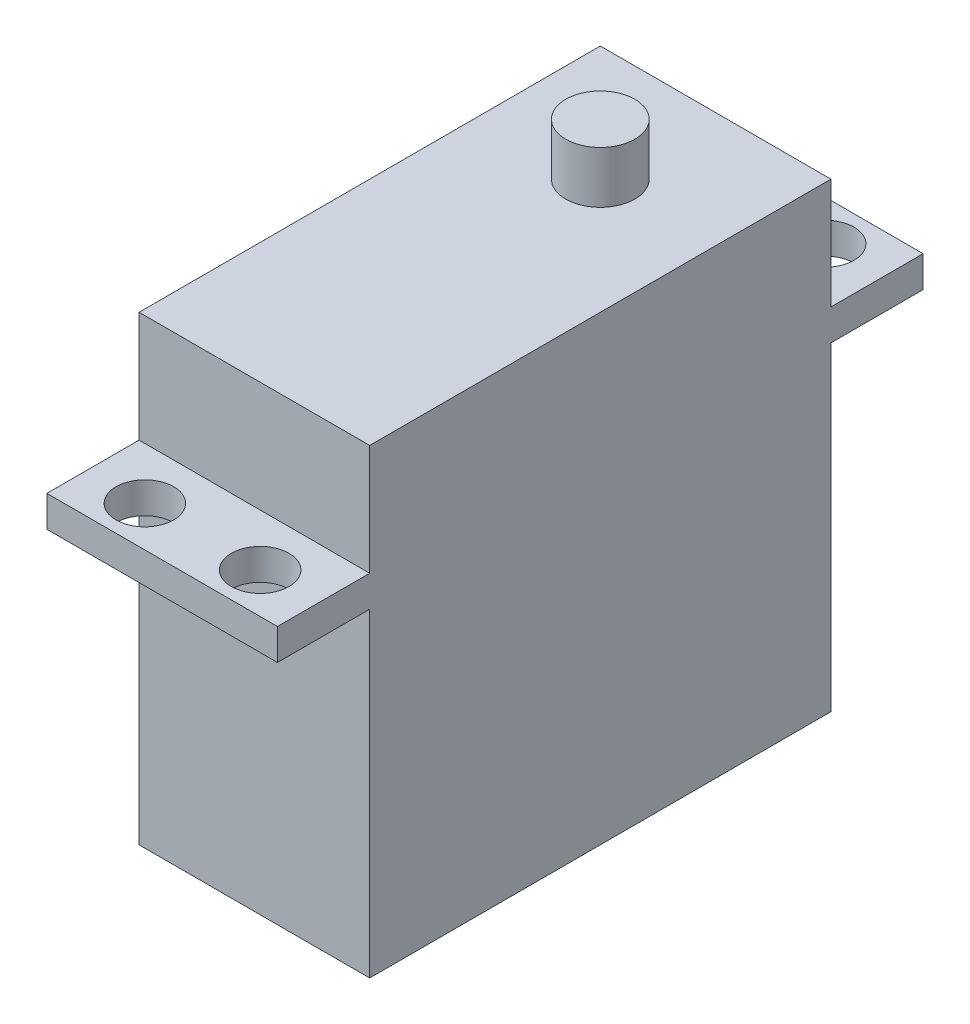
ISO-10303-21;
HEADER;
FILE_DESCRIPTION(('STEP AP214'),'2;1');
FILE_NAME('part.step','',(''),(''),'','','');
FILE_SCHEMA(('AUTOMOTIVE_DESIGN { 1 0 10303 214 1 1 1 1 }'));
ENDSEC;
DATA;
#1=APPLICATION_CONTEXT('core data for automotive mechanical design processes');
#2=APPLICATION_PROTOCOL_DEFINITION('international standard','automotive_design',2000,#1);
#3=PRODUCT_CONTEXT('',#1,'mechanical');
#4=PRODUCT('Part','Part','',(#3));
#5=PRODUCT_RELATED_PRODUCT_CATEGORY('part','',(#4));
#6=PRODUCT_DEFINITION_FORMATION('','',#4);
#7=PRODUCT_DEFINITION_CONTEXT('part definition',#1,'design');
#8=PRODUCT_DEFINITION('design','',#6,#7);
#9=PRODUCT_DEFINITION_SHAPE('','',#8);
#10=(LENGTH_UNIT() NAMED_UNIT(*) SI_UNIT(.MILLI.,.METRE.));
#11=(NAMED_UNIT(*) PLANE_ANGLE_UNIT() SI_UNIT($,.RADIAN.));
#12=(NAMED_UNIT(*) SI_UNIT($,.STERADIAN.) SOLID_ANGLE_UNIT());
#13=UNCERTAINTY_MEASURE_WITH_UNIT(LENGTH_MEASURE(1.E-05),#10,'distance_accuracy_value','');
#14=(GEOMETRIC_REPRESENTATION_CONTEXT(3) GLOBAL_UNCERTAINTY_ASSIGNED_CONTEXT((#13)) GLOBAL_UNIT_ASSIGNED_CONTEXT((#10,
#11,#12)) REPRESENTATION_CONTEXT('',''));
#15=CARTESIAN_POINT('',(0.,0.,0.));
#16=DIRECTION('',(0.,0.,1.));
#17=DIRECTION('',(1.,0.,0.));
#18=AXIS2_PLACEMENT_3D('',#15,#16,#17);
#19=CARTESIAN_POINT('',(-9.99999999999999,40.,20.));
#20=DIRECTION('',(0.,0.,-1.));
#21=DIRECTION('',(-1.,0.,0.));
#22=AXIS2_PLACEMENT_3D('',#19,#20,#21);
#23=PLANE('',#22);
#24=DIRECTION('',(1.,0.,0.));
#25=VECTOR('',#24,1.);
#26=CARTESIAN_POINT('',(-18.4433405711247,27.7,20.));
#27=LINE('',#26,#25);
#28=CARTESIAN_POINT('',(-9.99999999999999,27.7,20.));
#29=VERTEX_POINT('',#28);
#30=CARTESIAN_POINT('',(10.,27.7,20.));
#31=VERTEX_POINT('',#30);
#32=EDGE_CURVE('E56',#29,#31,#27,.T.);
#33=ORIENTED_EDGE('',*,*,#32,.F.);
#34=DIRECTION('',(0.,-1.,0.));
#35=VECTOR('',#34,1.);
#36=CARTESIAN_POINT('',(-9.99999999999999,40.,20.));
#37=LINE('',#36,#35);
#38=CARTESIAN_POINT('',(-9.99999999999999,0.,20.));
#39=VERTEX_POINT('',#38);
#40=EDGE_CURVE('E135',#29,#39,#37,.T.);
#41=ORIENTED_EDGE('',*,*,#40,.T.);
#42=DIRECTION('',(1.,0.,0.));
#43=VECTOR('',#42,1.);
#44=CARTESIAN_POINT('',(-9.99999999999999,0.,20.));
#45=LINE('',#44,#43);
#46=CARTESIAN_POINT('',(10.,0.,20.));
#47=VERTEX_POINT('',#46);
#48=EDGE_CURVE('E194',#39,#47,#45,.T.);
#49=ORIENTED_EDGE('',*,*,#48,.T.);
#50=DIRECTION('',(0.,-1.,0.));
#51=VECTOR('',#50,1.);
#52=CARTESIAN_POINT('',(10.,40.,20.));
#53=LINE('',#52,#51);
#54=EDGE_CURVE('E200',#31,#47,#53,.T.);
#55=ORIENTED_EDGE('',*,*,#54,.F.);
#56=EDGE_LOOP('',(#33,#41,#49,#55));
#57=FACE_BOUND('',#56,.T.);
#58=ADVANCED_FACE('F39',(#57),#23,.F.);
#59=CARTESIAN_POINT('',(-10.,40.,-20.));
#60=DIRECTION('',(0.,0.,1.));
#61=DIRECTION('',(1.,0.,0.));
#62=AXIS2_PLACEMENT_3D('',#59,#60,#61);
#63=PLANE('',#62);
#64=DIRECTION('',(1.,0.,0.));
#65=VECTOR('',#64,1.);
#66=CARTESIAN_POINT('',(-18.4433405711247,30.4,-20.));
#67=LINE('',#66,#65);
#68=CARTESIAN_POINT('',(-10.,30.4,-20.));
#69=VERTEX_POINT('',#68);
#70=CARTESIAN_POINT('',(10.,30.4,-20.));
#71=VERTEX_POINT('',#70);
#72=EDGE_CURVE('E168',#69,#71,#67,.T.);
#73=ORIENTED_EDGE('',*,*,#72,.F.);
#74=DIRECTION('',(0.,-1.,0.));
#75=VECTOR('',#74,1.);
#76=CARTESIAN_POINT('',(-10.,40.,-20.));
#77=LINE('',#76,#75);
#78=CARTESIAN_POINT('',(-10.,40.,-20.));
#79=VERTEX_POINT('',#78);
#80=EDGE_CURVE('E215',#79,#69,#77,.T.);
#81=ORIENTED_EDGE('',*,*,#80,.F.);
#82=DIRECTION('',(-1.,0.,0.));
#83=VECTOR('',#82,1.);
#84=CARTESIAN_POINT('',(-10.,40.,-20.));
#85=LINE('',#84,#83);
#86=CARTESIAN_POINT('',(10.,40.,-20.));
#87=VERTEX_POINT('',#86);
#88=EDGE_CURVE('E193',#87,#79,#85,.T.);
#89=ORIENTED_EDGE('',*,*,#88,.F.);
#90=DIRECTION('',(0.,-1.,0.));
#91=VECTOR('',#90,1.);
#92=CARTESIAN_POINT('',(10.,40.,-20.));
#93=LINE('',#92,#91);
#94=EDGE_CURVE('E11',#87,#71,#93,.T.);
#95=ORIENTED_EDGE('',*,*,#94,.T.);
#96=EDGE_LOOP('',(#73,#81,#89,#95));
#97=FACE_BOUND('',#96,.T.);
#98=ADVANCED_FACE('F268',(#97),#63,.F.);
#99=CARTESIAN_POINT('',(10.,40.,-20.));
#100=DIRECTION('',(-1.,0.,0.));
#101=DIRECTION('',(0.,0.,1.));
#102=AXIS2_PLACEMENT_3D('',#99,#100,#101);
#103=PLANE('',#102);
#104=DIRECTION('',(0.,0.,-1.));
#105=VECTOR('',#104,1.);
#106=CARTESIAN_POINT('',(10.,0.,-20.));
#107=LINE('',#106,#105);
#108=CARTESIAN_POINT('',(10.,0.,-20.));
#109=VERTEX_POINT('',#108);
#110=EDGE_CURVE('E189',#47,#109,#107,.T.);
#111=ORIENTED_EDGE('',*,*,#110,.T.);
#112=CARTESIAN_POINT('',(10.,27.7,-20.));
#113=VERTEX_POINT('',#112);
#114=EDGE_CURVE('E48',#113,#109,#93,.T.);
#115=ORIENTED_EDGE('',*,*,#114,.F.);
#116=DIRECTION('',(0.,0.,-1.));
#117=VECTOR('',#116,1.);
#118=CARTESIAN_POINT('',(10.,27.7,-20.));
#119=LINE('',#118,#117);
#120=CARTESIAN_POINT('',(10.,27.7,-28.));
#121=VERTEX_POINT('',#120);
#122=EDGE_CURVE('E163',#113,#121,#119,.T.);
#123=ORIENTED_EDGE('',*,*,#122,.T.);
#124=DIRECTION('',(0.,1.,0.));
#125=VECTOR('',#124,1.);
#126=CARTESIAN_POINT('',(10.,30.4,-28.));
#127=LINE('',#126,#125);
#128=CARTESIAN_POINT('',(10.,30.4,-28.));
#129=VERTEX_POINT('',#128);
#130=EDGE_CURVE('E173',#121,#129,#127,.T.);
#131=ORIENTED_EDGE('',*,*,#130,.T.);
#132=DIRECTION('',(0.,0.,1.));
#133=VECTOR('',#132,1.);
#134=CARTESIAN_POINT('',(10.,30.4,-20.));
#135=LINE('',#134,#133);
#136=EDGE_CURVE('E176',#129,#71,#135,.T.);
#137=ORIENTED_EDGE('',*,*,#136,.T.);
#138=ORIENTED_EDGE('',*,*,#94,.F.);
#139=DIRECTION('',(0.,0.,-1.));
#140=VECTOR('',#139,1.);
#141=CARTESIAN_POINT('',(10.,40.,-20.));
#142=LINE('',#141,#140);
#143=CARTESIAN_POINT('',(10.,40.,20.));
#144=VERTEX_POINT('',#143);
#145=EDGE_CURVE('E190',#144,#87,#142,.T.);
#146=ORIENTED_EDGE('',*,*,#145,.F.);
#147=CARTESIAN_POINT('',(10.,30.4,20.));
#148=VERTEX_POINT('',#147);
#149=EDGE_CURVE('E210',#144,#148,#53,.T.);
#150=ORIENTED_EDGE('',*,*,#149,.T.);
#151=DIRECTION('',(0.,0.,1.));
#152=VECTOR('',#151,1.);
#153=CARTESIAN_POINT('',(10.,30.4,20.));
#154=LINE('',#153,#152);
#155=CARTESIAN_POINT('',(10.,30.4,28.));
#156=VERTEX_POINT('',#155);
#157=EDGE_CURVE('E161',#148,#156,#154,.T.);
#158=ORIENTED_EDGE('',*,*,#157,.T.);
#159=DIRECTION('',(0.,-1.,0.));
#160=VECTOR('',#159,1.);
#161=CARTESIAN_POINT('',(10.,30.4,28.));
#162=LINE('',#161,#160);
#163=CARTESIAN_POINT('',(10.,27.7,28.));
#164=VERTEX_POINT('',#163);
#165=EDGE_CURVE('E159',#156,#164,#162,.T.);
#166=ORIENTED_EDGE('',*,*,#165,.T.);
#167=DIRECTION('',(0.,0.,-1.));
#168=VECTOR('',#167,1.);
#169=CARTESIAN_POINT('',(10.,27.7,20.));
#170=LINE('',#169,#168);
#171=EDGE_CURVE('E151',#164,#31,#170,.T.);
#172=ORIENTED_EDGE('',*,*,#171,.T.);
#173=ORIENTED_EDGE('',*,*,#54,.T.);
#174=EDGE_LOOP('',(#111,#115,#123,#131,#137,#138,#146,#150,#158,#166,#172,#173));
#175=FACE_BOUND('',#174,.T.);
#176=ADVANCED_FACE('F41',(#175),#103,.F.);
#177=CARTESIAN_POINT('',(-10.,27.7,-20.));
#178=VERTEX_POINT('',#177);
#179=CARTESIAN_POINT('',(-10.,0.,-20.));
#180=VERTEX_POINT('',#179);
#181=EDGE_CURVE('E214',#178,#180,#77,.T.);
#182=ORIENTED_EDGE('',*,*,#181,.F.);
#183=DIRECTION('',(1.,0.,0.));
#184=VECTOR('',#183,1.);
#185=CARTESIAN_POINT('',(-18.4433405711247,27.7,-20.));
#186=LINE('',#185,#184);
#187=EDGE_CURVE('E179',#178,#113,#186,.T.);
#188=ORIENTED_EDGE('',*,*,#187,.T.);
#189=ORIENTED_EDGE('',*,*,#114,.T.);
#190=DIRECTION('',(-1.,0.,0.));
#191=VECTOR('',#190,1.);
#192=CARTESIAN_POINT('',(-10.,0.,-20.));
#193=LINE('',#192,#191);
#194=EDGE_CURVE('E203',#109,#180,#193,.T.);
#195=ORIENTED_EDGE('',*,*,#194,.T.);
#196=EDGE_LOOP('',(#182,#188,#189,#195));
#197=FACE_BOUND('',#196,.T.);
#198=ADVANCED_FACE('F250',(#197),#63,.F.);
#199=CARTESIAN_POINT('',(-10.,40.,-20.));
#200=DIRECTION('',(1.,0.,0.));
#201=DIRECTION('',(0.,0.,-1.));
#202=AXIS2_PLACEMENT_3D('',#199,#200,#201);
#203=PLANE('',#202);
#204=DIRECTION('',(0.,0.,1.));
#205=VECTOR('',#204,1.);
#206=CARTESIAN_POINT('',(-10.,0.,-20.));
#207=LINE('',#206,#205);
#208=EDGE_CURVE('E206',#180,#39,#207,.T.);
#209=ORIENTED_EDGE('',*,*,#208,.T.);
#210=ORIENTED_EDGE('',*,*,#40,.F.);
#211=DIRECTION('',(0.,0.,1.));
#212=VECTOR('',#211,1.);
#213=CARTESIAN_POINT('',(-9.99999999999999,27.7,20.));
#214=LINE('',#213,#212);
#215=CARTESIAN_POINT('',(-9.99999999999999,27.7,28.));
#216=VERTEX_POINT('',#215);
#217=EDGE_CURVE('E129',#29,#216,#214,.T.);
#218=ORIENTED_EDGE('',*,*,#217,.T.);
#219=DIRECTION('',(0.,1.,0.));
#220=VECTOR('',#219,1.);
#221=CARTESIAN_POINT('',(-9.99999999999999,30.4,28.));
#222=LINE('',#221,#220);
#223=CARTESIAN_POINT('',(-9.99999999999999,30.4,28.));
#224=VERTEX_POINT('',#223);
#225=EDGE_CURVE('E133',#216,#224,#222,.T.);
#226=ORIENTED_EDGE('',*,*,#225,.T.);
#227=DIRECTION('',(0.,0.,-1.));
#228=VECTOR('',#227,1.);
#229=CARTESIAN_POINT('',(-9.99999999999999,30.4,20.));
#230=LINE('',#229,#228);
#231=CARTESIAN_POINT('',(-9.99999999999999,30.4,20.));
#232=VERTEX_POINT('',#231);
#233=EDGE_CURVE('E138',#224,#232,#230,.T.);
#234=ORIENTED_EDGE('',*,*,#233,.T.);
#235=CARTESIAN_POINT('',(-9.99999999999999,40.,20.));
#236=VERTEX_POINT('',#235);
#237=EDGE_CURVE('E64',#236,#232,#37,.T.);
#238=ORIENTED_EDGE('',*,*,#237,.F.);
#239=DIRECTION('',(0.,0.,1.));
#240=VECTOR('',#239,1.);
#241=CARTESIAN_POINT('',(-10.,40.,-20.));
#242=LINE('',#241,#240);
#243=EDGE_CURVE('E196',#79,#236,#242,.T.);
#244=ORIENTED_EDGE('',*,*,#243,.F.);
#245=ORIENTED_EDGE('',*,*,#80,.T.);
#246=DIRECTION('',(0.,0.,-1.));
#247=VECTOR('',#246,1.);
#248=CARTESIAN_POINT('',(-10.,30.4,-20.));
#249=LINE('',#248,#247);
#250=CARTESIAN_POINT('',(-10.,30.4,-28.));
#251=VERTEX_POINT('',#250);
#252=EDGE_CURVE('E167',#69,#251,#249,.T.);
#253=ORIENTED_EDGE('',*,*,#252,.T.);
#254=DIRECTION('',(0.,-1.,0.));
#255=VECTOR('',#254,1.);
#256=CARTESIAN_POINT('',(-10.,30.4,-28.));
#257=LINE('',#256,#255);
#258=CARTESIAN_POINT('',(-10.,27.7,-28.));
#259=VERTEX_POINT('',#258);
#260=EDGE_CURVE('E165',#251,#259,#257,.T.);
#261=ORIENTED_EDGE('',*,*,#260,.T.);
#262=DIRECTION('',(0.,0.,1.));
#263=VECTOR('',#262,1.);
#264=CARTESIAN_POINT('',(-10.,27.7,-20.));
#265=LINE('',#264,#263);
#266=EDGE_CURVE('E170',#259,#178,#265,.T.);
#267=ORIENTED_EDGE('',*,*,#266,.T.);
#268=ORIENTED_EDGE('',*,*,#181,.T.);
#269=EDGE_LOOP('',(#209,#210,#218,#226,#234,#238,#244,#245,#253,#261,#267,#268));
#270=FACE_BOUND('',#269,.T.);
#271=ADVANCED_FACE('F132',(#270),#203,.F.);
#272=ORIENTED_EDGE('',*,*,#237,.T.);
#273=DIRECTION('',(1.,0.,0.));
#274=VECTOR('',#273,1.);
#275=CARTESIAN_POINT('',(-18.4433405711247,30.4,20.));
#276=LINE('',#275,#274);
#277=EDGE_CURVE('E153',#232,#148,#276,.T.);
#278=ORIENTED_EDGE('',*,*,#277,.T.);
#279=ORIENTED_EDGE('',*,*,#149,.F.);
#280=DIRECTION('',(1.,0.,0.));
#281=VECTOR('',#280,1.);
#282=CARTESIAN_POINT('',(-9.99999999999999,40.,20.));
#283=LINE('',#282,#281);
#284=EDGE_CURVE('E198',#236,#144,#283,.T.);
#285=ORIENTED_EDGE('',*,*,#284,.F.);
#286=EDGE_LOOP('',(#272,#278,#279,#285));
#287=FACE_BOUND('',#286,.T.);
#288=ADVANCED_FACE('F235',(#287),#23,.F.);
#289=CARTESIAN_POINT('',(0.,40.,0.));
#290=DIRECTION('',(0.,1.,0.));
#291=DIRECTION('',(0.,0.,1.));
#292=AXIS2_PLACEMENT_3D('',#289,#290,#291);
#293=PLANE('',#292);
#294=CARTESIAN_POINT('',(0.,40.,-10.));
#295=DIRECTION('',(0.,1.,0.));
#296=DIRECTION('',(0.,0.,1.));
#297=AXIS2_PLACEMENT_3D('',#294,#295,#296);
#298=CIRCLE('',#297,3.);
#299=CARTESIAN_POINT('',(0.,40.,-7.));
#300=VERTEX_POINT('',#299);
#301=EDGE_CURVE('E417',#300,#300,#298,.T.);
#302=ORIENTED_EDGE('',*,*,#301,.F.);
#303=EDGE_LOOP('',(#302));
#304=FACE_BOUND('',#303,.T.);
#305=ORIENTED_EDGE('',*,*,#145,.T.);
#306=ORIENTED_EDGE('',*,*,#88,.T.);
#307=ORIENTED_EDGE('',*,*,#243,.T.);
#308=ORIENTED_EDGE('',*,*,#284,.T.);
#309=EDGE_LOOP('',(#305,#306,#307,#308));
#310=FACE_BOUND('',#309,.T.);
#311=ADVANCED_FACE('F271',(#304,#310),#293,.T.);
#312=CARTESIAN_POINT('',(0.,0.,0.));
#313=DIRECTION('',(0.,1.,0.));
#314=DIRECTION('',(0.,0.,1.));
#315=AXIS2_PLACEMENT_3D('',#312,#313,#314);
#316=PLANE('',#315);
#317=ORIENTED_EDGE('',*,*,#110,.F.);
#318=ORIENTED_EDGE('',*,*,#48,.F.);
#319=ORIENTED_EDGE('',*,*,#208,.F.);
#320=ORIENTED_EDGE('',*,*,#194,.F.);
#321=EDGE_LOOP('',(#317,#318,#319,#320));
#322=FACE_BOUND('',#321,.T.);
#323=ADVANCED_FACE('F248',(#322),#316,.F.);
#324=CARTESIAN_POINT('',(-18.4433405711247,30.4,-20.));
#325=DIRECTION('',(0.,1.,0.));
#326=DIRECTION('',(0.,0.,1.));
#327=AXIS2_PLACEMENT_3D('',#324,#325,#326);
#328=PLANE('',#327);
#329=CARTESIAN_POINT('',(-5.00000000000001,30.4,-24.5));
#330=DIRECTION('',(0.,1.,0.));
#331=DIRECTION('',(0.,0.,1.));
#332=AXIS2_PLACEMENT_3D('',#329,#330,#331);
#333=CIRCLE('',#332,2.5);
#334=CARTESIAN_POINT('',(-5.00000000000001,30.4,-22.));
#335=VERTEX_POINT('',#334);
#336=EDGE_CURVE('E425',#335,#335,#333,.T.);
#337=ORIENTED_EDGE('',*,*,#336,.F.);
#338=EDGE_LOOP('',(#337));
#339=FACE_BOUND('',#338,.T.);
#340=CARTESIAN_POINT('',(4.99999999999999,30.4,-24.5));
#341=DIRECTION('',(0.,1.,0.));
#342=DIRECTION('',(0.,0.,1.));
#343=AXIS2_PLACEMENT_3D('',#340,#341,#342);
#344=CIRCLE('',#343,2.5);
#345=CARTESIAN_POINT('',(4.99999999999999,30.4,-22.));
#346=VERTEX_POINT('',#345);
#347=EDGE_CURVE('E229',#346,#346,#344,.T.);
#348=ORIENTED_EDGE('',*,*,#347,.F.);
#349=EDGE_LOOP('',(#348));
#350=FACE_BOUND('',#349,.T.);
#351=ORIENTED_EDGE('',*,*,#252,.F.);
#352=ORIENTED_EDGE('',*,*,#72,.T.);
#353=ORIENTED_EDGE('',*,*,#136,.F.);
#354=DIRECTION('',(1.,0.,0.));
#355=VECTOR('',#354,1.);
#356=CARTESIAN_POINT('',(-18.4433405711247,30.4,-28.));
#357=LINE('',#356,#355);
#358=EDGE_CURVE('E182',#251,#129,#357,.T.);
#359=ORIENTED_EDGE('',*,*,#358,.F.);
#360=EDGE_LOOP('',(#351,#352,#353,#359));
#361=FACE_BOUND('',#360,.T.);
#362=ADVANCED_FACE('F265',(#339,#350,#361),#328,.T.);
#363=CARTESIAN_POINT('',(-18.4433405711247,30.4,-28.));
#364=DIRECTION('',(0.,0.,-1.));
#365=DIRECTION('',(-1.,0.,0.));
#366=AXIS2_PLACEMENT_3D('',#363,#364,#365);
#367=PLANE('',#366);
#368=ORIENTED_EDGE('',*,*,#260,.F.);
#369=ORIENTED_EDGE('',*,*,#358,.T.);
#370=ORIENTED_EDGE('',*,*,#130,.F.);
#371=DIRECTION('',(1.,0.,0.));
#372=VECTOR('',#371,1.);
#373=CARTESIAN_POINT('',(-18.4433405711247,27.7,-28.));
#374=LINE('',#373,#372);
#375=EDGE_CURVE('E184',#259,#121,#374,.T.);
#376=ORIENTED_EDGE('',*,*,#375,.F.);
#377=EDGE_LOOP('',(#368,#369,#370,#376));
#378=FACE_BOUND('',#377,.T.);
#379=ADVANCED_FACE('F260',(#378),#367,.T.);
#380=CARTESIAN_POINT('',(-18.4433405711247,27.7,-20.));
#381=DIRECTION('',(0.,-1.,0.));
#382=DIRECTION('',(0.,0.,-1.));
#383=AXIS2_PLACEMENT_3D('',#380,#381,#382);
#384=PLANE('',#383);
#385=CARTESIAN_POINT('',(-5.00000000000001,27.7,-24.5));
#386=DIRECTION('',(0.,-1.,0.));
#387=DIRECTION('',(0.,0.,-1.));
#388=AXIS2_PLACEMENT_3D('',#385,#386,#387);
#389=CIRCLE('',#388,2.5);
#390=CARTESIAN_POINT('',(-5.00000000000001,27.7,-27.));
#391=VERTEX_POINT('',#390);
#392=EDGE_CURVE('E43',#391,#391,#389,.T.);
#393=ORIENTED_EDGE('',*,*,#392,.F.);
#394=EDGE_LOOP('',(#393));
#395=FACE_BOUND('',#394,.T.);
#396=CARTESIAN_POINT('',(4.99999999999999,27.7,-24.5));
#397=DIRECTION('',(0.,-1.,0.));
#398=DIRECTION('',(0.,0.,-1.));
#399=AXIS2_PLACEMENT_3D('',#396,#397,#398);
#400=CIRCLE('',#399,2.5);
#401=CARTESIAN_POINT('',(4.99999999999999,27.7,-27.));
#402=VERTEX_POINT('',#401);
#403=EDGE_CURVE('E217',#402,#402,#400,.T.);
#404=ORIENTED_EDGE('',*,*,#403,.F.);
#405=EDGE_LOOP('',(#404));
#406=FACE_BOUND('',#405,.T.);
#407=ORIENTED_EDGE('',*,*,#266,.F.);
#408=ORIENTED_EDGE('',*,*,#375,.T.);
#409=ORIENTED_EDGE('',*,*,#122,.F.);
#410=ORIENTED_EDGE('',*,*,#187,.F.);
#411=EDGE_LOOP('',(#407,#408,#409,#410));
#412=FACE_BOUND('',#411,.T.);
#413=ADVANCED_FACE('F255',(#395,#406,#412),#384,.T.);
#414=CARTESIAN_POINT('',(-18.4433405711247,27.7,20.));
#415=DIRECTION('',(0.,-1.,0.));
#416=DIRECTION('',(0.,0.,-1.));
#417=AXIS2_PLACEMENT_3D('',#414,#415,#416);
#418=PLANE('',#417);
#419=CARTESIAN_POINT('',(4.99999999999999,27.7,24.5));
#420=DIRECTION('',(0.,-1.,0.));
#421=DIRECTION('',(0.,0.,-1.));
#422=AXIS2_PLACEMENT_3D('',#419,#420,#421);
#423=CIRCLE('',#422,2.5);
#424=CARTESIAN_POINT('',(4.99999999999999,27.7,22.));
#425=VERTEX_POINT('',#424);
#426=EDGE_CURVE('E219',#425,#425,#423,.T.);
#427=ORIENTED_EDGE('',*,*,#426,.F.);
#428=EDGE_LOOP('',(#427));
#429=FACE_BOUND('',#428,.T.);
#430=CARTESIAN_POINT('',(-5.00000000000001,27.7,24.5));
#431=DIRECTION('',(0.,-1.,0.));
#432=DIRECTION('',(0.,0.,-1.));
#433=AXIS2_PLACEMENT_3D('',#430,#431,#432);
#434=CIRCLE('',#433,2.5);
#435=CARTESIAN_POINT('',(-5.00000000000001,27.7,22.));
#436=VERTEX_POINT('',#435);
#437=EDGE_CURVE('E224',#436,#436,#434,.T.);
#438=ORIENTED_EDGE('',*,*,#437,.F.);
#439=EDGE_LOOP('',(#438));
#440=FACE_BOUND('',#439,.T.);
#441=ORIENTED_EDGE('',*,*,#217,.F.);
#442=ORIENTED_EDGE('',*,*,#32,.T.);
#443=ORIENTED_EDGE('',*,*,#171,.F.);
#444=DIRECTION('',(1.,0.,0.));
#445=VECTOR('',#444,1.);
#446=CARTESIAN_POINT('',(-18.4433405711247,27.7,28.));
#447=LINE('',#446,#445);
#448=EDGE_CURVE('E143',#216,#164,#447,.T.);
#449=ORIENTED_EDGE('',*,*,#448,.F.);
#450=EDGE_LOOP('',(#441,#442,#443,#449));
#451=FACE_BOUND('',#450,.T.);
#452=ADVANCED_FACE('F149',(#429,#440,#451),#418,.T.);
#453=CARTESIAN_POINT('',(-18.4433405711247,30.4,28.));
#454=DIRECTION('',(0.,0.,1.));
#455=DIRECTION('',(1.,0.,0.));
#456=AXIS2_PLACEMENT_3D('',#453,#454,#455);
#457=PLANE('',#456);
#458=ORIENTED_EDGE('',*,*,#225,.F.);
#459=ORIENTED_EDGE('',*,*,#448,.T.);
#460=ORIENTED_EDGE('',*,*,#165,.F.);
#461=DIRECTION('',(1.,0.,0.));
#462=VECTOR('',#461,1.);
#463=CARTESIAN_POINT('',(-18.4433405711247,30.4,28.));
#464=LINE('',#463,#462);
#465=EDGE_CURVE('E145',#224,#156,#464,.T.);
#466=ORIENTED_EDGE('',*,*,#465,.F.);
#467=EDGE_LOOP('',(#458,#459,#460,#466));
#468=FACE_BOUND('',#467,.T.);
#469=ADVANCED_FACE('F141',(#468),#457,.T.);
#470=CARTESIAN_POINT('',(-18.4433405711247,30.4,20.));
#471=DIRECTION('',(0.,1.,0.));
#472=DIRECTION('',(0.,0.,1.));
#473=AXIS2_PLACEMENT_3D('',#470,#471,#472);
#474=PLANE('',#473);
#475=CARTESIAN_POINT('',(4.99999999999999,30.4,24.5));
#476=DIRECTION('',(0.,1.,0.));
#477=DIRECTION('',(0.,0.,-1.));
#478=AXIS2_PLACEMENT_3D('',#475,#476,#477);
#479=CIRCLE('',#478,2.5);
#480=CARTESIAN_POINT('',(4.99999999999999,30.4,22.));
#481=VERTEX_POINT('',#480);
#482=EDGE_CURVE('E416',#481,#481,#479,.T.);
#483=ORIENTED_EDGE('',*,*,#482,.F.);
#484=EDGE_LOOP('',(#483));
#485=FACE_BOUND('',#484,.T.);
#486=CARTESIAN_POINT('',(-5.00000000000001,30.4,24.5));
#487=DIRECTION('',(0.,1.,0.));
#488=DIRECTION('',(0.,0.,-1.));
#489=AXIS2_PLACEMENT_3D('',#486,#487,#488);
#490=CIRCLE('',#489,2.5);
#491=CARTESIAN_POINT('',(-5.00000000000001,30.4,22.));
#492=VERTEX_POINT('',#491);
#493=EDGE_CURVE('E420',#492,#492,#490,.T.);
#494=ORIENTED_EDGE('',*,*,#493,.F.);
#495=EDGE_LOOP('',(#494));
#496=FACE_BOUND('',#495,.T.);
#497=ORIENTED_EDGE('',*,*,#233,.F.);
#498=ORIENTED_EDGE('',*,*,#465,.T.);
#499=ORIENTED_EDGE('',*,*,#157,.F.);
#500=ORIENTED_EDGE('',*,*,#277,.F.);
#501=EDGE_LOOP('',(#497,#498,#499,#500));
#502=FACE_BOUND('',#501,.T.);
#503=ADVANCED_FACE('F241',(#485,#496,#502),#474,.T.);
#504=CARTESIAN_POINT('',(-5.00000000000001,-9.59999999999999,24.5));
#505=DIRECTION('',(0.,1.,0.));
#506=DIRECTION('',(0.,0.,1.));
#507=AXIS2_PLACEMENT_3D('',#504,#505,#506);
#508=CYLINDRICAL_SURFACE('',#507,2.5);
#509=ORIENTED_EDGE('',*,*,#437,.T.);
#510=EDGE_LOOP('',(#509));
#511=FACE_BOUND('',#510,.T.);
#512=ORIENTED_EDGE('',*,*,#493,.T.);
#513=EDGE_LOOP('',(#512));
#514=FACE_BOUND('',#513,.T.);
#515=ADVANCED_FACE('F358',(#511,#514),#508,.F.);
#516=CARTESIAN_POINT('',(4.99999999999999,-9.59999999999999,24.5));
#517=DIRECTION('',(0.,1.,0.));
#518=DIRECTION('',(0.,0.,1.));
#519=AXIS2_PLACEMENT_3D('',#516,#517,#518);
#520=CYLINDRICAL_SURFACE('',#519,2.5);
#521=ORIENTED_EDGE('',*,*,#426,.T.);
#522=EDGE_LOOP('',(#521));
#523=FACE_BOUND('',#522,.T.);
#524=ORIENTED_EDGE('',*,*,#482,.T.);
#525=EDGE_LOOP('',(#524));
#526=FACE_BOUND('',#525,.T.);
#527=ADVANCED_FACE('F367',(#523,#526),#520,.F.);
#528=CARTESIAN_POINT('',(4.99999999999999,-9.59999999999999,-24.5));
#529=DIRECTION('',(0.,1.,0.));
#530=DIRECTION('',(0.,0.,1.));
#531=AXIS2_PLACEMENT_3D('',#528,#529,#530);
#532=CYLINDRICAL_SURFACE('',#531,2.5);
#533=ORIENTED_EDGE('',*,*,#403,.T.);
#534=EDGE_LOOP('',(#533));
#535=FACE_BOUND('',#534,.T.);
#536=ORIENTED_EDGE('',*,*,#347,.T.);
#537=EDGE_LOOP('',(#536));
#538=FACE_BOUND('',#537,.T.);
#539=ADVANCED_FACE('F376',(#535,#538),#532,.F.);
#540=CARTESIAN_POINT('',(-5.00000000000001,-9.59999999999999,-24.5));
#541=DIRECTION('',(0.,1.,0.));
#542=DIRECTION('',(0.,0.,1.));
#543=AXIS2_PLACEMENT_3D('',#540,#541,#542);
#544=CYLINDRICAL_SURFACE('',#543,2.5);
#545=ORIENTED_EDGE('',*,*,#392,.T.);
#546=EDGE_LOOP('',(#545));
#547=FACE_BOUND('',#546,.T.);
#548=ORIENTED_EDGE('',*,*,#336,.T.);
#549=EDGE_LOOP('',(#548));
#550=FACE_BOUND('',#549,.T.);
#551=ADVANCED_FACE('F384',(#547,#550),#544,.F.);
#552=CARTESIAN_POINT('',(0.,44.5,-10.));
#553=DIRECTION('',(0.,-1.,0.));
#554=DIRECTION('',(0.,0.,-1.));
#555=AXIS2_PLACEMENT_3D('',#552,#553,#554);
#556=CYLINDRICAL_SURFACE('',#555,3.);
#557=CARTESIAN_POINT('',(0.,44.5,-10.));
#558=DIRECTION('',(0.,1.,0.));
#559=DIRECTION('',(0.,0.,1.));
#560=AXIS2_PLACEMENT_3D('',#557,#558,#559);
#561=CIRCLE('',#560,3.);
#562=CARTESIAN_POINT('',(0.,44.5,-7.));
#563=VERTEX_POINT('',#562);
#564=EDGE_CURVE('E415',#563,#563,#561,.T.);
#565=ORIENTED_EDGE('',*,*,#564,.F.);
#566=EDGE_LOOP('',(#565));
#567=FACE_BOUND('',#566,.T.);
#568=ORIENTED_EDGE('',*,*,#301,.T.);
#569=EDGE_LOOP('',(#568));
#570=FACE_BOUND('',#569,.T.);
#571=ADVANCED_FACE('F391',(#567,#570),#556,.T.);
#572=CARTESIAN_POINT('',(0.,44.5,-10.));
#573=DIRECTION('',(0.,1.,0.));
#574=DIRECTION('',(0.,0.,1.));
#575=AXIS2_PLACEMENT_3D('',#572,#573,#574);
#576=PLANE('',#575);
#577=ORIENTED_EDGE('',*,*,#564,.T.);
#578=EDGE_LOOP('',(#577));
#579=FACE_BOUND('',#578,.T.);
#580=ADVANCED_FACE('F399',(#579),#576,.T.);
#581=CLOSED_SHELL('',(#58,#98,#176,#198,#271,#288,#311,#323,#362,#379,#413,#452,#469,#503,#515,
#527,#539,#551,#571,#580));
#582=MANIFOLD_SOLID_BREP('B2',#581);
#583=ADVANCED_BREP_SHAPE_REPRESENTATION('',(#18,#582),#14);
#584=SHAPE_DEFINITION_REPRESENTATION(#9,#583);
ENDSEC;
END-ISO-10303-21;
